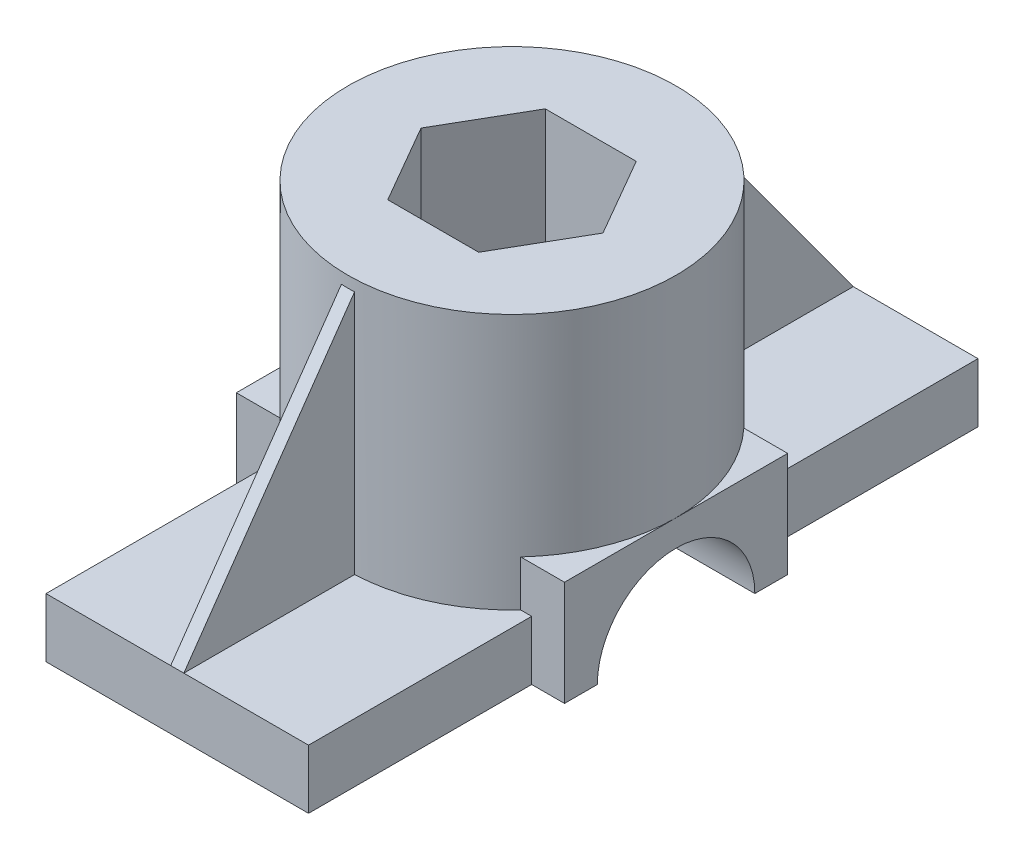
ISO-10303-21;
HEADER;
FILE_DESCRIPTION(('STEP AP214'),'2;1');
FILE_NAME('part.step','',(''),(''),'','','');
FILE_SCHEMA(('AUTOMOTIVE_DESIGN { 1 0 10303 214 1 1 1 1 }'));
ENDSEC;
DATA;
#1=APPLICATION_CONTEXT('core data for automotive mechanical design processes');
#2=APPLICATION_PROTOCOL_DEFINITION('international standard','automotive_design',2000,#1);
#3=PRODUCT_CONTEXT('',#1,'mechanical');
#4=PRODUCT('Part','Part','',(#3));
#5=PRODUCT_RELATED_PRODUCT_CATEGORY('part','',(#4));
#6=PRODUCT_DEFINITION_FORMATION('','',#4);
#7=PRODUCT_DEFINITION_CONTEXT('part definition',#1,'design');
#8=PRODUCT_DEFINITION('design','',#6,#7);
#9=PRODUCT_DEFINITION_SHAPE('','',#8);
#10=(LENGTH_UNIT() NAMED_UNIT(*) SI_UNIT(.MILLI.,.METRE.));
#11=(NAMED_UNIT(*) PLANE_ANGLE_UNIT() SI_UNIT($,.RADIAN.));
#12=(NAMED_UNIT(*) SI_UNIT($,.STERADIAN.) SOLID_ANGLE_UNIT());
#13=UNCERTAINTY_MEASURE_WITH_UNIT(LENGTH_MEASURE(1.E-05),#10,'distance_accuracy_value','');
#14=(GEOMETRIC_REPRESENTATION_CONTEXT(3) GLOBAL_UNCERTAINTY_ASSIGNED_CONTEXT((#13)) GLOBAL_UNIT_ASSIGNED_CONTEXT((#10,
#11,#12)) REPRESENTATION_CONTEXT('',''));
#15=CARTESIAN_POINT('',(0.,0.,0.));
#16=DIRECTION('',(0.,0.,1.));
#17=DIRECTION('',(1.,0.,0.));
#18=AXIS2_PLACEMENT_3D('',#15,#16,#17);
#19=CARTESIAN_POINT('',(0.,9.,-30.4766839378238));
#20=DIRECTION('',(0.,1.,0.));
#21=DIRECTION('',(0.,0.,1.));
#22=AXIS2_PLACEMENT_3D('',#19,#20,#21);
#23=CYLINDRICAL_SURFACE('',#22,25.);
#24=CARTESIAN_POINT('',(0.,48.,-30.4766839378238));
#25=DIRECTION('',(0.,1.,0.));
#26=DIRECTION('',(0.,0.,1.));
#27=AXIS2_PLACEMENT_3D('',#24,#25,#26);
#28=CIRCLE('',#27,25.);
#29=CARTESIAN_POINT('',(0.,48.,-5.47668393782383));
#30=VERTEX_POINT('',#29);
#31=EDGE_CURVE('E474',#30,#30,#28,.T.);
#32=ORIENTED_EDGE('',*,*,#31,.F.);
#33=EDGE_LOOP('',(#32));
#34=FACE_BOUND('',#33,.T.);
#35=CARTESIAN_POINT('',(0.,9.,-30.4766839378238));
#36=DIRECTION('',(0.,-1.,0.));
#37=DIRECTION('',(0.,0.,-1.));
#38=AXIS2_PLACEMENT_3D('',#35,#36,#37);
#39=CIRCLE('',#38,25.);
#40=CARTESIAN_POINT('',(1.,9.,-55.4566759314174));
#41=VERTEX_POINT('',#40);
#42=CARTESIAN_POINT('',(18.3303027798234,9.,-47.4766839378238));
#43=VERTEX_POINT('',#42);
#44=EDGE_CURVE('E386',#41,#43,#39,.T.);
#45=ORIENTED_EDGE('',*,*,#44,.F.);
#46=DIRECTION('',(0.,1.,0.));
#47=VECTOR('',#46,1.);
#48=CARTESIAN_POINT('',(1.,9.,-55.4566759314174));
#49=LINE('',#48,#47);
#50=CARTESIAN_POINT('',(1.,44.5662570889789,-55.4566759314174));
#51=VERTEX_POINT('',#50);
#52=EDGE_CURVE('E418',#41,#51,#49,.T.);
#53=ORIENTED_EDGE('',*,*,#52,.T.);
#54=CARTESIAN_POINT('',(0.,78.7109359494174,-30.4766839378238));
#55=DIRECTION('',(0.,-0.590449655374798,0.807074472689963));
#56=DIRECTION('',(0.,0.807074472689963,0.590449655374798));
#57=AXIS2_PLACEMENT_3D('',#54,#55,#56);
#58=ELLIPSE('',#57,42.3406124001052,25.);
#59=CARTESIAN_POINT('',(-1.,44.5662570889789,-55.4566759314174));
#60=VERTEX_POINT('',#59);
#61=EDGE_CURVE('E250',#51,#60,#58,.F.);
#62=ORIENTED_EDGE('',*,*,#61,.T.);
#63=DIRECTION('',(0.,1.,0.));
#64=VECTOR('',#63,1.);
#65=CARTESIAN_POINT('',(-1.,9.,-55.4566759314174));
#66=LINE('',#65,#64);
#67=CARTESIAN_POINT('',(-1.,9.,-55.4566759314174));
#68=VERTEX_POINT('',#67);
#69=EDGE_CURVE('E258',#68,#60,#66,.T.);
#70=ORIENTED_EDGE('',*,*,#69,.F.);
#71=CARTESIAN_POINT('',(-18.3303027798234,9.,-47.4766839378238));
#72=VERTEX_POINT('',#71);
#73=EDGE_CURVE('E267',#72,#68,#39,.T.);
#74=ORIENTED_EDGE('',*,*,#73,.F.);
#75=DIRECTION('',(0.,1.,0.));
#76=VECTOR('',#75,1.);
#77=CARTESIAN_POINT('',(-18.3303027798234,9.,-47.4766839378238));
#78=LINE('',#77,#76);
#79=CARTESIAN_POINT('',(-18.3303027798234,16.,-47.4766839378238));
#80=VERTEX_POINT('',#79);
#81=EDGE_CURVE('E487',#80,#72,#78,.F.);
#82=ORIENTED_EDGE('',*,*,#81,.F.);
#83=CARTESIAN_POINT('',(0.,16.,-30.4766839378238));
#84=DIRECTION('',(0.,1.,0.));
#85=DIRECTION('',(0.,0.,1.));
#86=AXIS2_PLACEMENT_3D('',#83,#84,#85);
#87=CIRCLE('',#86,25.);
#88=CARTESIAN_POINT('',(-25.,16.,-30.4766839378238));
#89=VERTEX_POINT('',#88);
#90=EDGE_CURVE('E507',#80,#89,#87,.T.);
#91=ORIENTED_EDGE('',*,*,#90,.T.);
#92=CARTESIAN_POINT('',(-18.3303027798234,16.,-13.4766839378238));
#93=VERTEX_POINT('',#92);
#94=EDGE_CURVE('E395',#89,#93,#87,.T.);
#95=ORIENTED_EDGE('',*,*,#94,.T.);
#96=DIRECTION('',(0.,1.,0.));
#97=VECTOR('',#96,1.);
#98=CARTESIAN_POINT('',(-18.3303027798234,9.,-13.4766839378238));
#99=LINE('',#98,#97);
#100=CARTESIAN_POINT('',(-18.3303027798234,9.,-13.4766839378238));
#101=VERTEX_POINT('',#100);
#102=EDGE_CURVE('E485',#101,#93,#99,.T.);
#103=ORIENTED_EDGE('',*,*,#102,.F.);
#104=CARTESIAN_POINT('',(0.,9.,-30.4766839378238));
#105=DIRECTION('',(0.,1.,0.));
#106=DIRECTION('',(0.,0.,1.));
#107=AXIS2_PLACEMENT_3D('',#104,#105,#106);
#108=CIRCLE('',#107,25.);
#109=CARTESIAN_POINT('',(-1.,9.,-5.49669194423024));
#110=VERTEX_POINT('',#109);
#111=EDGE_CURVE('E480',#101,#110,#108,.T.);
#112=ORIENTED_EDGE('',*,*,#111,.T.);
#113=DIRECTION('',(0.,1.,0.));
#114=VECTOR('',#113,1.);
#115=CARTESIAN_POINT('',(-1.,9.,-5.49669194423024));
#116=LINE('',#115,#114);
#117=CARTESIAN_POINT('',(-1.,46.3201014905884,-5.49669194423024));
#118=VERTEX_POINT('',#117);
#119=EDGE_CURVE('E396',#118,#110,#116,.F.);
#120=ORIENTED_EDGE('',*,*,#119,.F.);
#121=CARTESIAN_POINT('',(0.,82.1485238417831,-30.4766839378238));
#122=DIRECTION('',(0.,-0.571926215870423,-0.820305067398793));
#123=DIRECTION('',(0.,0.820305067398793,-0.571926215870423));
#124=AXIS2_PLACEMENT_3D('',#121,#122,#123);
#125=ELLIPSE('',#124,43.7119322497783,25.);
#126=CARTESIAN_POINT('',(1.,46.3201014905884,-5.49669194423024));
#127=VERTEX_POINT('',#126);
#128=EDGE_CURVE('E49',#118,#127,#125,.F.);
#129=ORIENTED_EDGE('',*,*,#128,.T.);
#130=DIRECTION('',(0.,1.,0.));
#131=VECTOR('',#130,1.);
#132=CARTESIAN_POINT('',(1.,9.,-5.49669194423024));
#133=LINE('',#132,#131);
#134=CARTESIAN_POINT('',(1.,9.,-5.49669194423024));
#135=VERTEX_POINT('',#134);
#136=EDGE_CURVE('E11',#127,#135,#133,.F.);
#137=ORIENTED_EDGE('',*,*,#136,.T.);
#138=CARTESIAN_POINT('',(18.3303027798234,9.,-13.4766839378238));
#139=VERTEX_POINT('',#138);
#140=EDGE_CURVE('E477',#135,#139,#108,.T.);
#141=ORIENTED_EDGE('',*,*,#140,.T.);
#142=DIRECTION('',(0.,1.,0.));
#143=VECTOR('',#142,1.);
#144=CARTESIAN_POINT('',(18.3303027798234,9.,-13.4766839378238));
#145=LINE('',#144,#143);
#146=CARTESIAN_POINT('',(18.3303027798234,16.,-13.4766839378238));
#147=VERTEX_POINT('',#146);
#148=EDGE_CURVE('E482',#147,#139,#145,.F.);
#149=ORIENTED_EDGE('',*,*,#148,.F.);
#150=CARTESIAN_POINT('',(25.,16.,-30.4766839378238));
#151=VERTEX_POINT('',#150);
#152=EDGE_CURVE('E473',#147,#151,#87,.T.);
#153=ORIENTED_EDGE('',*,*,#152,.T.);
#154=CARTESIAN_POINT('',(18.3303027798234,16.,-47.4766839378238));
#155=VERTEX_POINT('',#154);
#156=EDGE_CURVE('E398',#151,#155,#87,.T.);
#157=ORIENTED_EDGE('',*,*,#156,.T.);
#158=DIRECTION('',(0.,1.,0.));
#159=VECTOR('',#158,1.);
#160=CARTESIAN_POINT('',(18.3303027798234,9.,-47.4766839378238));
#161=LINE('',#160,#159);
#162=EDGE_CURVE('E285',#43,#155,#161,.T.);
#163=ORIENTED_EDGE('',*,*,#162,.F.);
#164=EDGE_LOOP('',(#45,#53,#62,#70,#74,#82,#91,#95,#103,#112,#120,#129,#137,#141,#149,#153,#157,#163));
#165=FACE_BOUND('',#164,.T.);
#166=ADVANCED_FACE('F41',(#34,#165),#23,.T.);
#167=CARTESIAN_POINT('',(20.,9.,-81.4766839378238));
#168=DIRECTION('',(0.,-1.,0.));
#169=DIRECTION('',(0.,0.,-1.));
#170=AXIS2_PLACEMENT_3D('',#167,#168,#169);
#171=PLANE('',#170);
#172=DIRECTION('',(0.,0.,-1.));
#173=VECTOR('',#172,1.);
#174=CARTESIAN_POINT('',(1.,9.,-54.2188227791459));
#175=LINE('',#174,#173);
#176=CARTESIAN_POINT('',(0.999999999999997,9.,-81.4766839378238));
#177=VERTEX_POINT('',#176);
#178=EDGE_CURVE('E251',#41,#177,#175,.T.);
#179=ORIENTED_EDGE('',*,*,#178,.F.);
#180=ORIENTED_EDGE('',*,*,#44,.T.);
#181=DIRECTION('',(1.,0.,0.));
#182=VECTOR('',#181,1.);
#183=CARTESIAN_POINT('',(20.,9.,-47.4766839378238));
#184=LINE('',#183,#182);
#185=CARTESIAN_POINT('',(20.,9.,-47.4766839378238));
#186=VERTEX_POINT('',#185);
#187=EDGE_CURVE('E284',#43,#186,#184,.T.);
#188=ORIENTED_EDGE('',*,*,#187,.T.);
#189=DIRECTION('',(0.,0.,1.));
#190=VECTOR('',#189,1.);
#191=CARTESIAN_POINT('',(20.,9.,-81.4766839378238));
#192=LINE('',#191,#190);
#193=CARTESIAN_POINT('',(20.,9.,-81.4766839378238));
#194=VERTEX_POINT('',#193);
#195=EDGE_CURVE('E294',#194,#186,#192,.T.);
#196=ORIENTED_EDGE('',*,*,#195,.F.);
#197=DIRECTION('',(1.,0.,0.));
#198=VECTOR('',#197,1.);
#199=CARTESIAN_POINT('',(20.,9.,-81.4766839378238));
#200=LINE('',#199,#198);
#201=EDGE_CURVE('E274',#177,#194,#200,.T.);
#202=ORIENTED_EDGE('',*,*,#201,.F.);
#203=EDGE_LOOP('',(#179,#180,#188,#196,#202));
#204=FACE_BOUND('',#203,.T.);
#205=ADVANCED_FACE('F520',(#204),#171,.F.);
#206=CARTESIAN_POINT('',(-20.,9.,20.5233160621762));
#207=DIRECTION('',(0.,1.,0.));
#208=DIRECTION('',(0.,0.,1.));
#209=AXIS2_PLACEMENT_3D('',#206,#207,#208);
#210=PLANE('',#209);
#211=ORIENTED_EDGE('',*,*,#140,.F.);
#212=DIRECTION('',(0.,0.,1.));
#213=VECTOR('',#212,1.);
#214=CARTESIAN_POINT('',(1.,9.,20.5233160621762));
#215=LINE('',#214,#213);
#216=CARTESIAN_POINT('',(1.,9.,20.5233160621762));
#217=VERTEX_POINT('',#216);
#218=EDGE_CURVE('E64',#135,#217,#215,.T.);
#219=ORIENTED_EDGE('',*,*,#218,.T.);
#220=DIRECTION('',(1.,0.,0.));
#221=VECTOR('',#220,1.);
#222=CARTESIAN_POINT('',(-20.,9.,20.5233160621762));
#223=LINE('',#222,#221);
#224=CARTESIAN_POINT('',(20.,9.,20.5233160621762));
#225=VERTEX_POINT('',#224);
#226=EDGE_CURVE('E390',#217,#225,#223,.T.);
#227=ORIENTED_EDGE('',*,*,#226,.T.);
#228=DIRECTION('',(0.,0.,1.));
#229=VECTOR('',#228,1.);
#230=CARTESIAN_POINT('',(20.,9.,20.5233160621762));
#231=LINE('',#230,#229);
#232=CARTESIAN_POINT('',(20.,9.,-13.4766839378238));
#233=VERTEX_POINT('',#232);
#234=EDGE_CURVE('E379',#233,#225,#231,.T.);
#235=ORIENTED_EDGE('',*,*,#234,.F.);
#236=DIRECTION('',(1.,0.,0.));
#237=VECTOR('',#236,1.);
#238=CARTESIAN_POINT('',(-20.,9.,-13.4766839378238));
#239=LINE('',#238,#237);
#240=EDGE_CURVE('E376',#139,#233,#239,.T.);
#241=ORIENTED_EDGE('',*,*,#240,.F.);
#242=EDGE_LOOP('',(#211,#219,#227,#235,#241));
#243=FACE_BOUND('',#242,.T.);
#244=ADVANCED_FACE('F585',(#243),#210,.T.);
#245=CARTESIAN_POINT('',(-25.,0.,-30.4766839378238));
#246=DIRECTION('',(1.,0.,0.));
#247=DIRECTION('',(0.,0.,-1.));
#248=AXIS2_PLACEMENT_3D('',#245,#246,#247);
#249=CYLINDRICAL_SURFACE('',#248,12.);
#250=CARTESIAN_POINT('',(-13.856406460551,0.,-30.4766839378238));
#251=DIRECTION('',(-0.866025403784439,0.,-0.5));
#252=DIRECTION('',(0.5,0.,-0.866025403784439));
#253=AXIS2_PLACEMENT_3D('',#250,#251,#252);
#254=ELLIPSE('',#253,13.856406460551,12.);
#255=CARTESIAN_POINT('',(-13.856406460551,12.,-30.4766839378238));
#256=VERTEX_POINT('',#255);
#257=CARTESIAN_POINT('',(-6.92820323027552,0.,-42.4766839378238));
#258=VERTEX_POINT('',#257);
#259=EDGE_CURVE('E434',#256,#258,#254,.T.);
#260=ORIENTED_EDGE('',*,*,#259,.F.);
#261=CARTESIAN_POINT('',(-13.856406460551,0.,-30.4766839378238));
#262=DIRECTION('',(-0.866025403784439,0.,0.5));
#263=DIRECTION('',(0.5,0.,0.866025403784439));
#264=AXIS2_PLACEMENT_3D('',#261,#262,#263);
#265=ELLIPSE('',#264,13.856406460551,12.);
#266=CARTESIAN_POINT('',(-6.92820323027552,0.,-18.4766839378238));
#267=VERTEX_POINT('',#266);
#268=EDGE_CURVE('E437',#267,#256,#265,.T.);
#269=ORIENTED_EDGE('',*,*,#268,.F.);
#270=DIRECTION('',(1.,0.,0.));
#271=VECTOR('',#270,1.);
#272=CARTESIAN_POINT('',(-25.,0.,-18.4766839378238));
#273=LINE('',#272,#271);
#274=CARTESIAN_POINT('',(-25.,0.,-18.4766839378238));
#275=VERTEX_POINT('',#274);
#276=EDGE_CURVE('E355',#275,#267,#273,.T.);
#277=ORIENTED_EDGE('',*,*,#276,.F.);
#278=CARTESIAN_POINT('',(-25.,0.,-30.4766839378238));
#279=DIRECTION('',(-1.,0.,0.));
#280=DIRECTION('',(0.,0.,1.));
#281=AXIS2_PLACEMENT_3D('',#278,#279,#280);
#282=CIRCLE('',#281,12.);
#283=CARTESIAN_POINT('',(-25.,0.,-42.4766839378238));
#284=VERTEX_POINT('',#283);
#285=EDGE_CURVE('E327',#284,#275,#282,.F.);
#286=ORIENTED_EDGE('',*,*,#285,.F.);
#287=DIRECTION('',(1.,0.,0.));
#288=VECTOR('',#287,1.);
#289=CARTESIAN_POINT('',(-25.,0.,-42.4766839378238));
#290=LINE('',#289,#288);
#291=EDGE_CURVE('E359',#284,#258,#290,.T.);
#292=ORIENTED_EDGE('',*,*,#291,.T.);
#293=EDGE_LOOP('',(#260,#269,#277,#286,#292));
#294=FACE_BOUND('',#293,.T.);
#295=ADVANCED_FACE('F609',(#294),#249,.F.);
#296=CARTESIAN_POINT('',(-25.,16.,0.));
#297=DIRECTION('',(0.,-1.,0.));
#298=DIRECTION('',(0.,0.,-1.));
#299=AXIS2_PLACEMENT_3D('',#296,#297,#298);
#300=PLANE('',#299);
#301=ORIENTED_EDGE('',*,*,#152,.F.);
#302=DIRECTION('',(1.,0.,0.));
#303=VECTOR('',#302,1.);
#304=CARTESIAN_POINT('',(-25.,16.,-13.4766839378238));
#305=LINE('',#304,#303);
#306=CARTESIAN_POINT('',(25.,16.,-13.4766839378238));
#307=VERTEX_POINT('',#306);
#308=EDGE_CURVE('E347',#147,#307,#305,.T.);
#309=ORIENTED_EDGE('',*,*,#308,.T.);
#310=DIRECTION('',(0.,0.,-1.));
#311=VECTOR('',#310,1.);
#312=CARTESIAN_POINT('',(25.,16.,0.));
#313=LINE('',#312,#311);
#314=EDGE_CURVE('E314',#307,#151,#313,.T.);
#315=ORIENTED_EDGE('',*,*,#314,.T.);
#316=EDGE_LOOP('',(#301,#309,#315));
#317=FACE_BOUND('',#316,.T.);
#318=ADVANCED_FACE('F606',(#317),#300,.F.);
#319=ORIENTED_EDGE('',*,*,#156,.F.);
#320=CARTESIAN_POINT('',(25.,16.,-47.4766839378238));
#321=VERTEX_POINT('',#320);
#322=EDGE_CURVE('E313',#151,#321,#313,.T.);
#323=ORIENTED_EDGE('',*,*,#322,.T.);
#324=DIRECTION('',(1.,0.,0.));
#325=VECTOR('',#324,1.);
#326=CARTESIAN_POINT('',(-25.,16.,-47.4766839378238));
#327=LINE('',#326,#325);
#328=EDGE_CURVE('E343',#155,#321,#327,.T.);
#329=ORIENTED_EDGE('',*,*,#328,.F.);
#330=EDGE_LOOP('',(#319,#323,#329));
#331=FACE_BOUND('',#330,.T.);
#332=ADVANCED_FACE('F538',(#331),#300,.F.);
#333=ORIENTED_EDGE('',*,*,#90,.F.);
#334=CARTESIAN_POINT('',(-25.,16.,-47.4766839378238));
#335=VERTEX_POINT('',#334);
#336=EDGE_CURVE('E344',#335,#80,#327,.T.);
#337=ORIENTED_EDGE('',*,*,#336,.F.);
#338=DIRECTION('',(0.,0.,-1.));
#339=VECTOR('',#338,1.);
#340=CARTESIAN_POINT('',(-25.,16.,0.));
#341=LINE('',#340,#339);
#342=EDGE_CURVE('E333',#89,#335,#341,.T.);
#343=ORIENTED_EDGE('',*,*,#342,.F.);
#344=EDGE_LOOP('',(#333,#337,#343));
#345=FACE_BOUND('',#344,.T.);
#346=ADVANCED_FACE('F548',(#345),#300,.F.);
#347=ORIENTED_EDGE('',*,*,#94,.F.);
#348=CARTESIAN_POINT('',(-25.,16.,-13.4766839378238));
#349=VERTEX_POINT('',#348);
#350=EDGE_CURVE('E334',#349,#89,#341,.T.);
#351=ORIENTED_EDGE('',*,*,#350,.F.);
#352=EDGE_CURVE('E348',#349,#93,#305,.T.);
#353=ORIENTED_EDGE('',*,*,#352,.T.);
#354=EDGE_LOOP('',(#347,#351,#353));
#355=FACE_BOUND('',#354,.T.);
#356=ADVANCED_FACE('F545',(#355),#300,.F.);
#357=CARTESIAN_POINT('',(-25.,0.,-47.4766839378238));
#358=DIRECTION('',(0.,0.,1.));
#359=DIRECTION('',(1.,0.,0.));
#360=AXIS2_PLACEMENT_3D('',#357,#358,#359);
#361=PLANE('',#360);
#362=ORIENTED_EDGE('',*,*,#187,.F.);
#363=ORIENTED_EDGE('',*,*,#162,.T.);
#364=ORIENTED_EDGE('',*,*,#328,.T.);
#365=DIRECTION('',(0.,-1.,0.));
#366=VECTOR('',#365,1.);
#367=CARTESIAN_POINT('',(25.,0.,-47.4766839378238));
#368=LINE('',#367,#366);
#369=CARTESIAN_POINT('',(25.,0.,-47.4766839378238));
#370=VERTEX_POINT('',#369);
#371=EDGE_CURVE('E309',#321,#370,#368,.T.);
#372=ORIENTED_EDGE('',*,*,#371,.T.);
#373=DIRECTION('',(1.,0.,0.));
#374=VECTOR('',#373,1.);
#375=CARTESIAN_POINT('',(-25.,0.,-47.4766839378238));
#376=LINE('',#375,#374);
#377=CARTESIAN_POINT('',(20.,0.,-47.4766839378238));
#378=VERTEX_POINT('',#377);
#379=EDGE_CURVE('E339',#378,#370,#376,.T.);
#380=ORIENTED_EDGE('',*,*,#379,.F.);
#381=DIRECTION('',(0.,-1.,0.));
#382=VECTOR('',#381,1.);
#383=CARTESIAN_POINT('',(20.,0.,-47.4766839378238));
#384=LINE('',#383,#382);
#385=EDGE_CURVE('E288',#186,#378,#384,.T.);
#386=ORIENTED_EDGE('',*,*,#385,.F.);
#387=EDGE_LOOP('',(#362,#363,#364,#372,#380,#386));
#388=FACE_BOUND('',#387,.T.);
#389=ADVANCED_FACE('F535',(#388),#361,.F.);
#390=CARTESIAN_POINT('',(-25.,0.,-13.4766839378238));
#391=DIRECTION('',(0.,0.,-1.));
#392=DIRECTION('',(-1.,0.,0.));
#393=AXIS2_PLACEMENT_3D('',#390,#391,#392);
#394=PLANE('',#393);
#395=CARTESIAN_POINT('',(-20.,9.,-13.4766839378238));
#396=VERTEX_POINT('',#395);
#397=EDGE_CURVE('E391',#396,#101,#239,.T.);
#398=ORIENTED_EDGE('',*,*,#397,.T.);
#399=ORIENTED_EDGE('',*,*,#102,.T.);
#400=ORIENTED_EDGE('',*,*,#352,.F.);
#401=DIRECTION('',(0.,1.,0.));
#402=VECTOR('',#401,1.);
#403=CARTESIAN_POINT('',(-25.,0.,-13.4766839378238));
#404=LINE('',#403,#402);
#405=CARTESIAN_POINT('',(-25.,0.,-13.4766839378238));
#406=VERTEX_POINT('',#405);
#407=EDGE_CURVE('E331',#406,#349,#404,.T.);
#408=ORIENTED_EDGE('',*,*,#407,.F.);
#409=DIRECTION('',(1.,0.,0.));
#410=VECTOR('',#409,1.);
#411=CARTESIAN_POINT('',(-25.,0.,-13.4766839378238));
#412=LINE('',#411,#410);
#413=CARTESIAN_POINT('',(-20.,0.,-13.4766839378238));
#414=VERTEX_POINT('',#413);
#415=EDGE_CURVE('E351',#406,#414,#412,.T.);
#416=ORIENTED_EDGE('',*,*,#415,.T.);
#417=DIRECTION('',(0.,1.,0.));
#418=VECTOR('',#417,1.);
#419=CARTESIAN_POINT('',(-20.,9.,-13.4766839378238));
#420=LINE('',#419,#418);
#421=EDGE_CURVE('E366',#414,#396,#420,.T.);
#422=ORIENTED_EDGE('',*,*,#421,.T.);
#423=EDGE_LOOP('',(#398,#399,#400,#408,#416,#422));
#424=FACE_BOUND('',#423,.T.);
#425=ADVANCED_FACE('F555',(#424),#394,.F.);
#426=ORIENTED_EDGE('',*,*,#336,.T.);
#427=ORIENTED_EDGE('',*,*,#81,.T.);
#428=CARTESIAN_POINT('',(-20.,9.,-47.4766839378238));
#429=VERTEX_POINT('',#428);
#430=EDGE_CURVE('E286',#429,#72,#184,.T.);
#431=ORIENTED_EDGE('',*,*,#430,.F.);
#432=DIRECTION('',(0.,1.,0.));
#433=VECTOR('',#432,1.);
#434=CARTESIAN_POINT('',(-20.,9.,-47.4766839378238));
#435=LINE('',#434,#433);
#436=CARTESIAN_POINT('',(-20.,0.,-47.4766839378238));
#437=VERTEX_POINT('',#436);
#438=EDGE_CURVE('E281',#437,#429,#435,.T.);
#439=ORIENTED_EDGE('',*,*,#438,.F.);
#440=CARTESIAN_POINT('',(-25.,0.,-47.4766839378238));
#441=VERTEX_POINT('',#440);
#442=EDGE_CURVE('E340',#441,#437,#376,.T.);
#443=ORIENTED_EDGE('',*,*,#442,.F.);
#444=DIRECTION('',(0.,-1.,0.));
#445=VECTOR('',#444,1.);
#446=CARTESIAN_POINT('',(-25.,0.,-47.4766839378238));
#447=LINE('',#446,#445);
#448=EDGE_CURVE('E337',#335,#441,#447,.T.);
#449=ORIENTED_EDGE('',*,*,#448,.F.);
#450=EDGE_LOOP('',(#426,#427,#431,#439,#443,#449));
#451=FACE_BOUND('',#450,.T.);
#452=ADVANCED_FACE('F501',(#451),#361,.F.);
#453=CARTESIAN_POINT('',(-20.,0.,-13.4766839378238));
#454=DIRECTION('',(0.,-1.,0.));
#455=DIRECTION('',(0.,0.,-1.));
#456=AXIS2_PLACEMENT_3D('',#453,#454,#455);
#457=PLANE('',#456);
#458=DIRECTION('',(0.,0.,-1.));
#459=VECTOR('',#458,1.);
#460=CARTESIAN_POINT('',(20.,0.,-13.4766839378238));
#461=LINE('',#460,#459);
#462=CARTESIAN_POINT('',(20.,0.,20.5233160621762));
#463=VERTEX_POINT('',#462);
#464=CARTESIAN_POINT('',(20.,0.,-13.4766839378238));
#465=VERTEX_POINT('',#464);
#466=EDGE_CURVE('E362',#463,#465,#461,.T.);
#467=ORIENTED_EDGE('',*,*,#466,.F.);
#468=DIRECTION('',(1.,0.,0.));
#469=VECTOR('',#468,1.);
#470=CARTESIAN_POINT('',(-20.,0.,20.5233160621762));
#471=LINE('',#470,#469);
#472=CARTESIAN_POINT('',(-20.,0.,20.5233160621762));
#473=VERTEX_POINT('',#472);
#474=EDGE_CURVE('E384',#473,#463,#471,.T.);
#475=ORIENTED_EDGE('',*,*,#474,.F.);
#476=DIRECTION('',(0.,0.,-1.));
#477=VECTOR('',#476,1.);
#478=CARTESIAN_POINT('',(-20.,0.,-13.4766839378238));
#479=LINE('',#478,#477);
#480=EDGE_CURVE('E363',#473,#414,#479,.T.);
#481=ORIENTED_EDGE('',*,*,#480,.T.);
#482=ORIENTED_EDGE('',*,*,#415,.F.);
#483=DIRECTION('',(0.,0.,1.));
#484=VECTOR('',#483,1.);
#485=CARTESIAN_POINT('',(-25.,0.,0.));
#486=LINE('',#485,#484);
#487=EDGE_CURVE('E329',#275,#406,#486,.T.);
#488=ORIENTED_EDGE('',*,*,#487,.F.);
#489=ORIENTED_EDGE('',*,*,#276,.T.);
#490=DIRECTION('',(1.,0.,0.));
#491=VECTOR('',#490,1.);
#492=CARTESIAN_POINT('',(-25.,0.,-18.4766839378238));
#493=LINE('',#492,#491);
#494=CARTESIAN_POINT('',(6.92820323027547,0.,-18.4766839378238));
#495=VERTEX_POINT('',#494);
#496=EDGE_CURVE('E426',#267,#495,#493,.T.);
#497=ORIENTED_EDGE('',*,*,#496,.T.);
#498=CARTESIAN_POINT('',(25.,0.,-18.4766839378238));
#499=VERTEX_POINT('',#498);
#500=EDGE_CURVE('E354',#495,#499,#273,.T.);
#501=ORIENTED_EDGE('',*,*,#500,.T.);
#502=DIRECTION('',(0.,0.,1.));
#503=VECTOR('',#502,1.);
#504=CARTESIAN_POINT('',(25.,0.,0.));
#505=LINE('',#504,#503);
#506=CARTESIAN_POINT('',(25.,0.,-13.4766839378238));
#507=VERTEX_POINT('',#506);
#508=EDGE_CURVE('E310',#499,#507,#505,.T.);
#509=ORIENTED_EDGE('',*,*,#508,.T.);
#510=DIRECTION('',(-1.,0.,0.));
#511=VECTOR('',#510,1.);
#512=CARTESIAN_POINT('',(25.,0.,-13.4766839378238));
#513=LINE('',#512,#511);
#514=EDGE_CURVE('E322',#507,#465,#513,.T.);
#515=ORIENTED_EDGE('',*,*,#514,.T.);
#516=EDGE_LOOP('',(#467,#475,#481,#482,#488,#489,#497,#501,#509,#515));
#517=FACE_BOUND('',#516,.T.);
#518=ADVANCED_FACE('F43',(#517),#457,.T.);
#519=CARTESIAN_POINT('',(-20.,0.,20.5233160621762));
#520=DIRECTION('',(0.,0.,1.));
#521=DIRECTION('',(1.,0.,0.));
#522=AXIS2_PLACEMENT_3D('',#519,#520,#521);
#523=PLANE('',#522);
#524=DIRECTION('',(0.,-1.,0.));
#525=VECTOR('',#524,1.);
#526=CARTESIAN_POINT('',(20.,0.,20.5233160621762));
#527=LINE('',#526,#525);
#528=EDGE_CURVE('E367',#225,#463,#527,.T.);
#529=ORIENTED_EDGE('',*,*,#528,.F.);
#530=ORIENTED_EDGE('',*,*,#226,.F.);
#531=DIRECTION('',(-1.,0.,0.));
#532=VECTOR('',#531,1.);
#533=CARTESIAN_POINT('',(1.,9.,20.5233160621762));
#534=LINE('',#533,#532);
#535=CARTESIAN_POINT('',(-1.,9.,20.5233160621762));
#536=VERTEX_POINT('',#535);
#537=EDGE_CURVE('E413',#217,#536,#534,.T.);
#538=ORIENTED_EDGE('',*,*,#537,.T.);
#539=CARTESIAN_POINT('',(-20.,9.,20.5233160621762));
#540=VERTEX_POINT('',#539);
#541=EDGE_CURVE('E387',#540,#536,#223,.T.);
#542=ORIENTED_EDGE('',*,*,#541,.F.);
#543=DIRECTION('',(0.,-1.,0.));
#544=VECTOR('',#543,1.);
#545=CARTESIAN_POINT('',(-20.,0.,20.5233160621762));
#546=LINE('',#545,#544);
#547=EDGE_CURVE('E373',#540,#473,#546,.T.);
#548=ORIENTED_EDGE('',*,*,#547,.T.);
#549=ORIENTED_EDGE('',*,*,#474,.T.);
#550=EDGE_LOOP('',(#529,#530,#538,#542,#548,#549));
#551=FACE_BOUND('',#550,.T.);
#552=ADVANCED_FACE('F566',(#551),#523,.T.);
#553=DIRECTION('',(0.,0.,1.));
#554=VECTOR('',#553,1.);
#555=CARTESIAN_POINT('',(-1.,9.,20.5233160621762));
#556=LINE('',#555,#554);
#557=EDGE_CURVE('E416',#110,#536,#556,.T.);
#558=ORIENTED_EDGE('',*,*,#557,.F.);
#559=ORIENTED_EDGE('',*,*,#111,.F.);
#560=ORIENTED_EDGE('',*,*,#397,.F.);
#561=DIRECTION('',(0.,0.,1.));
#562=VECTOR('',#561,1.);
#563=CARTESIAN_POINT('',(-20.,9.,20.5233160621762));
#564=LINE('',#563,#562);
#565=EDGE_CURVE('E370',#396,#540,#564,.T.);
#566=ORIENTED_EDGE('',*,*,#565,.T.);
#567=ORIENTED_EDGE('',*,*,#541,.T.);
#568=EDGE_LOOP('',(#558,#559,#560,#566,#567));
#569=FACE_BOUND('',#568,.T.);
#570=ADVANCED_FACE('F559',(#569),#210,.T.);
#571=CARTESIAN_POINT('',(-20.,0.,0.));
#572=DIRECTION('',(-1.,0.,0.));
#573=DIRECTION('',(0.,0.,1.));
#574=AXIS2_PLACEMENT_3D('',#571,#572,#573);
#575=PLANE('',#574);
#576=ORIENTED_EDGE('',*,*,#480,.F.);
#577=ORIENTED_EDGE('',*,*,#547,.F.);
#578=ORIENTED_EDGE('',*,*,#565,.F.);
#579=ORIENTED_EDGE('',*,*,#421,.F.);
#580=EDGE_LOOP('',(#576,#577,#578,#579));
#581=FACE_BOUND('',#580,.T.);
#582=ADVANCED_FACE('F563',(#581),#575,.T.);
#583=CARTESIAN_POINT('',(20.,0.,0.));
#584=DIRECTION('',(-1.,0.,0.));
#585=DIRECTION('',(0.,0.,1.));
#586=AXIS2_PLACEMENT_3D('',#583,#584,#585);
#587=PLANE('',#586);
#588=ORIENTED_EDGE('',*,*,#466,.T.);
#589=DIRECTION('',(0.,1.,0.));
#590=VECTOR('',#589,1.);
#591=CARTESIAN_POINT('',(20.,0.,-13.4766839378238));
#592=LINE('',#591,#590);
#593=EDGE_CURVE('E302',#465,#233,#592,.T.);
#594=ORIENTED_EDGE('',*,*,#593,.T.);
#595=ORIENTED_EDGE('',*,*,#234,.T.);
#596=ORIENTED_EDGE('',*,*,#528,.T.);
#597=EDGE_LOOP('',(#588,#594,#595,#596));
#598=FACE_BOUND('',#597,.T.);
#599=ADVANCED_FACE('F614',(#598),#587,.F.);
#600=ORIENTED_EDGE('',*,*,#308,.F.);
#601=ORIENTED_EDGE('',*,*,#148,.T.);
#602=ORIENTED_EDGE('',*,*,#240,.T.);
#603=ORIENTED_EDGE('',*,*,#593,.F.);
#604=ORIENTED_EDGE('',*,*,#514,.F.);
#605=DIRECTION('',(0.,1.,0.));
#606=VECTOR('',#605,1.);
#607=CARTESIAN_POINT('',(25.,0.,-13.4766839378238));
#608=LINE('',#607,#606);
#609=EDGE_CURVE('E317',#507,#307,#608,.T.);
#610=ORIENTED_EDGE('',*,*,#609,.T.);
#611=EDGE_LOOP('',(#600,#601,#602,#603,#604,#610));
#612=FACE_BOUND('',#611,.T.);
#613=ADVANCED_FACE('F611',(#612),#394,.F.);
#614=CARTESIAN_POINT('',(-25.,0.,0.));
#615=DIRECTION('',(0.,1.,0.));
#616=DIRECTION('',(0.,0.,1.));
#617=AXIS2_PLACEMENT_3D('',#614,#615,#616);
#618=PLANE('',#617);
#619=ORIENTED_EDGE('',*,*,#442,.T.);
#620=DIRECTION('',(0.,0.,1.));
#621=VECTOR('',#620,1.);
#622=CARTESIAN_POINT('',(-20.,0.,-81.4766839378238));
#623=LINE('',#622,#621);
#624=CARTESIAN_POINT('',(-20.,0.,-81.4766839378238));
#625=VERTEX_POINT('',#624);
#626=EDGE_CURVE('E299',#625,#437,#623,.T.);
#627=ORIENTED_EDGE('',*,*,#626,.F.);
#628=DIRECTION('',(-1.,0.,0.));
#629=VECTOR('',#628,1.);
#630=CARTESIAN_POINT('',(-20.,0.,-81.4766839378238));
#631=LINE('',#630,#629);
#632=CARTESIAN_POINT('',(20.,0.,-81.4766839378238));
#633=VERTEX_POINT('',#632);
#634=EDGE_CURVE('E291',#633,#625,#631,.T.);
#635=ORIENTED_EDGE('',*,*,#634,.F.);
#636=DIRECTION('',(0.,0.,1.));
#637=VECTOR('',#636,1.);
#638=CARTESIAN_POINT('',(20.,0.,-81.4766839378238));
#639=LINE('',#638,#637);
#640=EDGE_CURVE('E276',#633,#378,#639,.T.);
#641=ORIENTED_EDGE('',*,*,#640,.T.);
#642=ORIENTED_EDGE('',*,*,#379,.T.);
#643=CARTESIAN_POINT('',(25.,0.,-42.4766839378238));
#644=VERTEX_POINT('',#643);
#645=EDGE_CURVE('E306',#370,#644,#505,.T.);
#646=ORIENTED_EDGE('',*,*,#645,.T.);
#647=CARTESIAN_POINT('',(6.92820323027549,0.,-42.4766839378238));
#648=VERTEX_POINT('',#647);
#649=EDGE_CURVE('E358',#648,#644,#290,.T.);
#650=ORIENTED_EDGE('',*,*,#649,.F.);
#651=DIRECTION('',(1.,0.,0.));
#652=VECTOR('',#651,1.);
#653=CARTESIAN_POINT('',(-25.,0.,-42.4766839378238));
#654=LINE('',#653,#652);
#655=EDGE_CURVE('E429',#258,#648,#654,.T.);
#656=ORIENTED_EDGE('',*,*,#655,.F.);
#657=ORIENTED_EDGE('',*,*,#291,.F.);
#658=DIRECTION('',(0.,0.,1.));
#659=VECTOR('',#658,1.);
#660=CARTESIAN_POINT('',(-25.,0.,0.));
#661=LINE('',#660,#659);
#662=EDGE_CURVE('E324',#441,#284,#661,.T.);
#663=ORIENTED_EDGE('',*,*,#662,.F.);
#664=EDGE_LOOP('',(#619,#627,#635,#641,#642,#646,#650,#656,#657,#663));
#665=FACE_BOUND('',#664,.T.);
#666=ADVANCED_FACE('F495',(#665),#618,.F.);
#667=ORIENTED_EDGE('',*,*,#500,.F.);
#668=CARTESIAN_POINT('',(13.856406460551,0.,-30.4766839378238));
#669=DIRECTION('',(0.866025403784439,0.,0.5));
#670=DIRECTION('',(0.5,0.,-0.866025403784439));
#671=AXIS2_PLACEMENT_3D('',#668,#669,#670);
#672=ELLIPSE('',#671,13.856406460551,12.);
#673=CARTESIAN_POINT('',(13.856406460551,12.,-30.4766839378238));
#674=VERTEX_POINT('',#673);
#675=EDGE_CURVE('E432',#674,#495,#672,.T.);
#676=ORIENTED_EDGE('',*,*,#675,.F.);
#677=CARTESIAN_POINT('',(13.856406460551,0.,-30.4766839378238));
#678=DIRECTION('',(0.866025403784439,0.,-0.5));
#679=DIRECTION('',(0.5,0.,0.866025403784439));
#680=AXIS2_PLACEMENT_3D('',#677,#678,#679);
#681=ELLIPSE('',#680,13.856406460551,12.);
#682=EDGE_CURVE('E460',#648,#674,#681,.T.);
#683=ORIENTED_EDGE('',*,*,#682,.F.);
#684=ORIENTED_EDGE('',*,*,#649,.T.);
#685=CARTESIAN_POINT('',(25.,0.,-30.4766839378238));
#686=DIRECTION('',(1.,0.,0.));
#687=DIRECTION('',(0.,0.,-1.));
#688=AXIS2_PLACEMENT_3D('',#685,#686,#687);
#689=CIRCLE('',#688,12.);
#690=EDGE_CURVE('E303',#644,#499,#689,.T.);
#691=ORIENTED_EDGE('',*,*,#690,.T.);
#692=EDGE_LOOP('',(#667,#676,#683,#684,#691));
#693=FACE_BOUND('',#692,.T.);
#694=ADVANCED_FACE('F603',(#693),#249,.F.);
#695=CARTESIAN_POINT('',(-25.,0.,0.));
#696=DIRECTION('',(-1.,0.,0.));
#697=DIRECTION('',(0.,0.,1.));
#698=AXIS2_PLACEMENT_3D('',#695,#696,#697);
#699=PLANE('',#698);
#700=ORIENTED_EDGE('',*,*,#350,.T.);
#701=ORIENTED_EDGE('',*,*,#342,.T.);
#702=ORIENTED_EDGE('',*,*,#448,.T.);
#703=ORIENTED_EDGE('',*,*,#662,.T.);
#704=ORIENTED_EDGE('',*,*,#285,.T.);
#705=ORIENTED_EDGE('',*,*,#487,.T.);
#706=ORIENTED_EDGE('',*,*,#407,.T.);
#707=EDGE_LOOP('',(#700,#701,#702,#703,#704,#705,#706));
#708=FACE_BOUND('',#707,.T.);
#709=ADVANCED_FACE('F550',(#708),#699,.T.);
#710=CARTESIAN_POINT('',(25.,0.,0.));
#711=DIRECTION('',(1.,0.,0.));
#712=DIRECTION('',(0.,0.,-1.));
#713=AXIS2_PLACEMENT_3D('',#710,#711,#712);
#714=PLANE('',#713);
#715=ORIENTED_EDGE('',*,*,#371,.F.);
#716=ORIENTED_EDGE('',*,*,#322,.F.);
#717=ORIENTED_EDGE('',*,*,#314,.F.);
#718=ORIENTED_EDGE('',*,*,#609,.F.);
#719=ORIENTED_EDGE('',*,*,#508,.F.);
#720=ORIENTED_EDGE('',*,*,#690,.F.);
#721=ORIENTED_EDGE('',*,*,#645,.F.);
#722=EDGE_LOOP('',(#715,#716,#717,#718,#719,#720,#721));
#723=FACE_BOUND('',#722,.T.);
#724=ADVANCED_FACE('F531',(#723),#714,.T.);
#725=CARTESIAN_POINT('',(-20.,9.,-81.4766839378238));
#726=DIRECTION('',(1.,0.,0.));
#727=DIRECTION('',(0.,0.,-1.));
#728=AXIS2_PLACEMENT_3D('',#725,#726,#727);
#729=PLANE('',#728);
#730=ORIENTED_EDGE('',*,*,#438,.T.);
#731=DIRECTION('',(0.,0.,1.));
#732=VECTOR('',#731,1.);
#733=CARTESIAN_POINT('',(-20.,9.,-81.4766839378238));
#734=LINE('',#733,#732);
#735=CARTESIAN_POINT('',(-20.,9.,-81.4766839378238));
#736=VERTEX_POINT('',#735);
#737=EDGE_CURVE('E297',#736,#429,#734,.T.);
#738=ORIENTED_EDGE('',*,*,#737,.F.);
#739=DIRECTION('',(0.,1.,0.));
#740=VECTOR('',#739,1.);
#741=CARTESIAN_POINT('',(-20.,9.,-81.4766839378238));
#742=LINE('',#741,#740);
#743=EDGE_CURVE('E271',#625,#736,#742,.T.);
#744=ORIENTED_EDGE('',*,*,#743,.F.);
#745=ORIENTED_EDGE('',*,*,#626,.T.);
#746=EDGE_LOOP('',(#730,#738,#744,#745));
#747=FACE_BOUND('',#746,.T.);
#748=ADVANCED_FACE('F499',(#747),#729,.F.);
#749=ORIENTED_EDGE('',*,*,#73,.T.);
#750=DIRECTION('',(0.,0.,-1.));
#751=VECTOR('',#750,1.);
#752=CARTESIAN_POINT('',(-1.,9.,-54.2188227791459));
#753=LINE('',#752,#751);
#754=CARTESIAN_POINT('',(-1.,9.,-81.4766839378238));
#755=VERTEX_POINT('',#754);
#756=EDGE_CURVE('E256',#68,#755,#753,.T.);
#757=ORIENTED_EDGE('',*,*,#756,.T.);
#758=EDGE_CURVE('E265',#736,#755,#200,.T.);
#759=ORIENTED_EDGE('',*,*,#758,.F.);
#760=ORIENTED_EDGE('',*,*,#737,.T.);
#761=ORIENTED_EDGE('',*,*,#430,.T.);
#762=EDGE_LOOP('',(#749,#757,#759,#760,#761));
#763=FACE_BOUND('',#762,.T.);
#764=ADVANCED_FACE('F263',(#763),#171,.F.);
#765=CARTESIAN_POINT('',(20.,0.,-81.4766839378238));
#766=DIRECTION('',(-1.,0.,0.));
#767=DIRECTION('',(0.,0.,1.));
#768=AXIS2_PLACEMENT_3D('',#765,#766,#767);
#769=PLANE('',#768);
#770=ORIENTED_EDGE('',*,*,#385,.T.);
#771=ORIENTED_EDGE('',*,*,#640,.F.);
#772=DIRECTION('',(0.,-1.,0.));
#773=VECTOR('',#772,1.);
#774=CARTESIAN_POINT('',(20.,0.,-81.4766839378238));
#775=LINE('',#774,#773);
#776=EDGE_CURVE('E273',#194,#633,#775,.T.);
#777=ORIENTED_EDGE('',*,*,#776,.F.);
#778=ORIENTED_EDGE('',*,*,#195,.T.);
#779=EDGE_LOOP('',(#770,#771,#777,#778));
#780=FACE_BOUND('',#779,.T.);
#781=ADVANCED_FACE('F524',(#780),#769,.F.);
#782=CARTESIAN_POINT('',(20.,0.,-81.4766839378238));
#783=DIRECTION('',(0.,0.,1.));
#784=DIRECTION('',(1.,0.,0.));
#785=AXIS2_PLACEMENT_3D('',#782,#783,#784);
#786=PLANE('',#785);
#787=ORIENTED_EDGE('',*,*,#634,.T.);
#788=ORIENTED_EDGE('',*,*,#743,.T.);
#789=ORIENTED_EDGE('',*,*,#758,.T.);
#790=DIRECTION('',(-1.,0.,0.));
#791=VECTOR('',#790,1.);
#792=CARTESIAN_POINT('',(1.,9.,-81.4766839378238));
#793=LINE('',#792,#791);
#794=EDGE_CURVE('E243',#177,#755,#793,.T.);
#795=ORIENTED_EDGE('',*,*,#794,.F.);
#796=ORIENTED_EDGE('',*,*,#201,.T.);
#797=ORIENTED_EDGE('',*,*,#776,.T.);
#798=EDGE_LOOP('',(#787,#788,#789,#795,#796,#797));
#799=FACE_BOUND('',#798,.T.);
#800=ADVANCED_FACE('F270',(#799),#786,.F.);
#801=CARTESIAN_POINT('',(0.,48.,-30.4766839378238));
#802=DIRECTION('',(0.,1.,0.));
#803=DIRECTION('',(0.,0.,1.));
#804=AXIS2_PLACEMENT_3D('',#801,#802,#803);
#805=PLANE('',#804);
#806=DIRECTION('',(-0.5,0.,0.866025403784439));
#807=VECTOR('',#806,1.);
#808=CARTESIAN_POINT('',(-6.92820323027552,48.,-42.4766839378238));
#809=LINE('',#808,#807);
#810=CARTESIAN_POINT('',(-6.92820323027552,48.,-42.4766839378238));
#811=VERTEX_POINT('',#810);
#812=CARTESIAN_POINT('',(-13.856406460551,48.,-30.4766839378238));
#813=VERTEX_POINT('',#812);
#814=EDGE_CURVE('E449',#811,#813,#809,.T.);
#815=ORIENTED_EDGE('',*,*,#814,.F.);
#816=DIRECTION('',(-1.,0.,0.));
#817=VECTOR('',#816,1.);
#818=CARTESIAN_POINT('',(6.92820323027549,48.,-42.4766839378238));
#819=LINE('',#818,#817);
#820=CARTESIAN_POINT('',(6.92820323027549,48.,-42.4766839378238));
#821=VERTEX_POINT('',#820);
#822=EDGE_CURVE('E446',#821,#811,#819,.T.);
#823=ORIENTED_EDGE('',*,*,#822,.F.);
#824=DIRECTION('',(-0.5,0.,-0.866025403784438));
#825=VECTOR('',#824,1.);
#826=CARTESIAN_POINT('',(13.856406460551,48.,-30.4766839378238));
#827=LINE('',#826,#825);
#828=CARTESIAN_POINT('',(13.856406460551,48.,-30.4766839378238));
#829=VERTEX_POINT('',#828);
#830=EDGE_CURVE('E443',#829,#821,#827,.T.);
#831=ORIENTED_EDGE('',*,*,#830,.F.);
#832=DIRECTION('',(0.5,0.,-0.866025403784439));
#833=VECTOR('',#832,1.);
#834=CARTESIAN_POINT('',(6.9282032302755,48.,-18.4766839378238));
#835=LINE('',#834,#833);
#836=CARTESIAN_POINT('',(6.9282032302755,48.,-18.4766839378238));
#837=VERTEX_POINT('',#836);
#838=EDGE_CURVE('E440',#837,#829,#835,.T.);
#839=ORIENTED_EDGE('',*,*,#838,.F.);
#840=DIRECTION('',(1.,0.,0.));
#841=VECTOR('',#840,1.);
#842=CARTESIAN_POINT('',(-6.92820323027552,48.,-18.4766839378238));
#843=LINE('',#842,#841);
#844=CARTESIAN_POINT('',(-6.92820323027552,48.,-18.4766839378238));
#845=VERTEX_POINT('',#844);
#846=EDGE_CURVE('E454',#845,#837,#843,.T.);
#847=ORIENTED_EDGE('',*,*,#846,.F.);
#848=DIRECTION('',(0.5,0.,0.866025403784439));
#849=VECTOR('',#848,1.);
#850=CARTESIAN_POINT('',(-13.856406460551,48.,-30.4766839378238));
#851=LINE('',#850,#849);
#852=EDGE_CURVE('E452',#813,#845,#851,.T.);
#853=ORIENTED_EDGE('',*,*,#852,.F.);
#854=EDGE_LOOP('',(#815,#823,#831,#839,#847,#853));
#855=FACE_BOUND('',#854,.T.);
#856=ORIENTED_EDGE('',*,*,#31,.T.);
#857=EDGE_LOOP('',(#856));
#858=FACE_BOUND('',#857,.T.);
#859=ADVANCED_FACE('F590',(#855,#858),#805,.T.);
#860=CARTESIAN_POINT('',(6.9282032302755,-0.001000000000001,-18.4766839378238));
#861=DIRECTION('',(0.866025403784439,0.,0.5));
#862=DIRECTION('',(0.5,0.,-0.866025403784439));
#863=AXIS2_PLACEMENT_3D('',#860,#861,#862);
#864=PLANE('',#863);
#865=ORIENTED_EDGE('',*,*,#675,.T.);
#866=DIRECTION('',(0.,1.,0.));
#867=VECTOR('',#866,1.);
#868=CARTESIAN_POINT('',(6.9282032302755,-0.001000000000001,-18.4766839378238));
#869=LINE('',#868,#867);
#870=EDGE_CURVE('E458',#495,#837,#869,.T.);
#871=ORIENTED_EDGE('',*,*,#870,.T.);
#872=ORIENTED_EDGE('',*,*,#838,.T.);
#873=DIRECTION('',(0.,1.,0.));
#874=VECTOR('',#873,1.);
#875=CARTESIAN_POINT('',(13.856406460551,-0.001000000000001,-30.4766839378238));
#876=LINE('',#875,#874);
#877=EDGE_CURVE('E457',#674,#829,#876,.T.);
#878=ORIENTED_EDGE('',*,*,#877,.F.);
#879=EDGE_LOOP('',(#865,#871,#872,#878));
#880=FACE_BOUND('',#879,.T.);
#881=ADVANCED_FACE('F661',(#880),#864,.F.);
#882=CARTESIAN_POINT('',(-13.856406460551,-0.001000000000001,-30.4766839378238));
#883=DIRECTION('',(-0.866025403784439,0.,0.5));
#884=DIRECTION('',(0.5,0.,0.866025403784439));
#885=AXIS2_PLACEMENT_3D('',#882,#883,#884);
#886=PLANE('',#885);
#887=ORIENTED_EDGE('',*,*,#268,.T.);
#888=DIRECTION('',(0.,1.,0.));
#889=VECTOR('',#888,1.);
#890=CARTESIAN_POINT('',(-13.856406460551,-0.001000000000001,-30.4766839378238));
#891=LINE('',#890,#889);
#892=EDGE_CURVE('E464',#256,#813,#891,.T.);
#893=ORIENTED_EDGE('',*,*,#892,.T.);
#894=ORIENTED_EDGE('',*,*,#852,.T.);
#895=DIRECTION('',(0.,1.,0.));
#896=VECTOR('',#895,1.);
#897=CARTESIAN_POINT('',(-6.92820323027552,-0.001000000000001,-18.4766839378238));
#898=LINE('',#897,#896);
#899=EDGE_CURVE('E461',#267,#845,#898,.T.);
#900=ORIENTED_EDGE('',*,*,#899,.F.);
#901=EDGE_LOOP('',(#887,#893,#894,#900));
#902=FACE_BOUND('',#901,.T.);
#903=ADVANCED_FACE('F653',(#902),#886,.F.);
#904=CARTESIAN_POINT('',(-6.92820323027552,-0.001000000000001,-42.4766839378238));
#905=DIRECTION('',(-0.866025403784439,0.,-0.5));
#906=DIRECTION('',(-0.5,0.,0.866025403784439));
#907=AXIS2_PLACEMENT_3D('',#904,#905,#906);
#908=PLANE('',#907);
#909=ORIENTED_EDGE('',*,*,#259,.T.);
#910=DIRECTION('',(0.,1.,0.));
#911=VECTOR('',#910,1.);
#912=CARTESIAN_POINT('',(-6.92820323027552,-0.001000000000001,-42.4766839378238));
#913=LINE('',#912,#911);
#914=EDGE_CURVE('E466',#258,#811,#913,.T.);
#915=ORIENTED_EDGE('',*,*,#914,.T.);
#916=ORIENTED_EDGE('',*,*,#814,.T.);
#917=ORIENTED_EDGE('',*,*,#892,.F.);
#918=EDGE_LOOP('',(#909,#915,#916,#917));
#919=FACE_BOUND('',#918,.T.);
#920=ADVANCED_FACE('F671',(#919),#908,.F.);
#921=CARTESIAN_POINT('',(6.92820323027549,-0.001000000000001,-42.4766839378238));
#922=DIRECTION('',(0.,0.,-1.));
#923=DIRECTION('',(-1.,0.,0.));
#924=AXIS2_PLACEMENT_3D('',#921,#922,#923);
#925=PLANE('',#924);
#926=ORIENTED_EDGE('',*,*,#655,.T.);
#927=DIRECTION('',(0.,1.,0.));
#928=VECTOR('',#927,1.);
#929=CARTESIAN_POINT('',(6.92820323027549,-0.001000000000001,-42.4766839378238));
#930=LINE('',#929,#928);
#931=EDGE_CURVE('E468',#648,#821,#930,.T.);
#932=ORIENTED_EDGE('',*,*,#931,.T.);
#933=ORIENTED_EDGE('',*,*,#822,.T.);
#934=ORIENTED_EDGE('',*,*,#914,.F.);
#935=EDGE_LOOP('',(#926,#932,#933,#934));
#936=FACE_BOUND('',#935,.T.);
#937=ADVANCED_FACE('F666',(#936),#925,.F.);
#938=CARTESIAN_POINT('',(13.856406460551,-0.001000000000001,-30.4766839378238));
#939=DIRECTION('',(0.866025403784439,0.,-0.5));
#940=DIRECTION('',(-0.5,0.,-0.866025403784439));
#941=AXIS2_PLACEMENT_3D('',#938,#939,#940);
#942=PLANE('',#941);
#943=ORIENTED_EDGE('',*,*,#682,.T.);
#944=ORIENTED_EDGE('',*,*,#877,.T.);
#945=ORIENTED_EDGE('',*,*,#830,.T.);
#946=ORIENTED_EDGE('',*,*,#931,.F.);
#947=EDGE_LOOP('',(#943,#944,#945,#946));
#948=FACE_BOUND('',#947,.T.);
#949=ADVANCED_FACE('F664',(#948),#942,.F.);
#950=CARTESIAN_POINT('',(-6.92820323027552,-0.001000000000001,-18.4766839378238));
#951=DIRECTION('',(0.,0.,1.));
#952=DIRECTION('',(1.,0.,0.));
#953=AXIS2_PLACEMENT_3D('',#950,#951,#952);
#954=PLANE('',#953);
#955=ORIENTED_EDGE('',*,*,#899,.T.);
#956=ORIENTED_EDGE('',*,*,#846,.T.);
#957=ORIENTED_EDGE('',*,*,#870,.F.);
#958=ORIENTED_EDGE('',*,*,#496,.F.);
#959=EDGE_LOOP('',(#955,#956,#957,#958));
#960=FACE_BOUND('',#959,.T.);
#961=ADVANCED_FACE('F658',(#960),#954,.F.);
#962=CARTESIAN_POINT('',(1.,47.6802311778357,-6.44499015185573));
#963=DIRECTION('',(0.,-0.571926215870423,-0.820305067398793));
#964=DIRECTION('',(0.,0.820305067398793,-0.571926215870423));
#965=AXIS2_PLACEMENT_3D('',#962,#963,#964);
#966=PLANE('',#965);
#967=ORIENTED_EDGE('',*,*,#128,.F.);
#968=DIRECTION('',(0.,-0.820305067398793,0.571926215870423));
#969=VECTOR('',#968,1.);
#970=CARTESIAN_POINT('',(-1.,47.6802311778357,-6.44499015185573));
#971=LINE('',#970,#969);
#972=EDGE_CURVE('E414',#118,#536,#971,.T.);
#973=ORIENTED_EDGE('',*,*,#972,.T.);
#974=ORIENTED_EDGE('',*,*,#537,.F.);
#975=DIRECTION('',(0.,-0.820305067398793,0.571926215870423));
#976=VECTOR('',#975,1.);
#977=CARTESIAN_POINT('',(1.,47.6802311778357,-6.44499015185573));
#978=LINE('',#977,#976);
#979=EDGE_CURVE('E410',#127,#217,#978,.T.);
#980=ORIENTED_EDGE('',*,*,#979,.F.);
#981=EDGE_LOOP('',(#967,#973,#974,#980));
#982=FACE_BOUND('',#981,.T.);
#983=ADVANCED_FACE('F412',(#982),#966,.F.);
#984=CARTESIAN_POINT('',(1.,0.,0.));
#985=DIRECTION('',(-1.,0.,0.));
#986=DIRECTION('',(0.,0.,1.));
#987=AXIS2_PLACEMENT_3D('',#984,#985,#986);
#988=PLANE('',#987);
#989=ORIENTED_EDGE('',*,*,#218,.F.);
#990=ORIENTED_EDGE('',*,*,#136,.F.);
#991=ORIENTED_EDGE('',*,*,#979,.T.);
#992=EDGE_LOOP('',(#989,#990,#991));
#993=FACE_BOUND('',#992,.T.);
#994=ADVANCED_FACE('F409',(#993),#988,.F.);
#995=CARTESIAN_POINT('',(-1.,0.,0.));
#996=DIRECTION('',(-1.,0.,0.));
#997=DIRECTION('',(0.,0.,1.));
#998=AXIS2_PLACEMENT_3D('',#995,#996,#997);
#999=PLANE('',#998);
#1000=ORIENTED_EDGE('',*,*,#119,.T.);
#1001=ORIENTED_EDGE('',*,*,#557,.T.);
#1002=ORIENTED_EDGE('',*,*,#972,.F.);
#1003=EDGE_LOOP('',(#1000,#1001,#1002));
#1004=FACE_BOUND('',#1003,.T.);
#1005=ADVANCED_FACE('F569',(#1004),#999,.T.);
#1006=CARTESIAN_POINT('',(1.,9.,-81.4766839378238));
#1007=DIRECTION('',(0.,-0.590449655374798,0.807074472689963));
#1008=DIRECTION('',(0.,-0.807074472689963,-0.590449655374798));
#1009=AXIS2_PLACEMENT_3D('',#1006,#1007,#1008);
#1010=PLANE('',#1009);
#1011=ORIENTED_EDGE('',*,*,#61,.F.);
#1012=DIRECTION('',(0.,0.807074472689963,0.590449655374798));
#1013=VECTOR('',#1012,1.);
#1014=CARTESIAN_POINT('',(1.,9.,-81.4766839378238));
#1015=LINE('',#1014,#1013);
#1016=EDGE_CURVE('E56',#177,#51,#1015,.T.);
#1017=ORIENTED_EDGE('',*,*,#1016,.F.);
#1018=ORIENTED_EDGE('',*,*,#794,.T.);
#1019=DIRECTION('',(0.,0.807074472689963,0.590449655374798));
#1020=VECTOR('',#1019,1.);
#1021=CARTESIAN_POINT('',(-1.,9.,-81.4766839378238));
#1022=LINE('',#1021,#1020);
#1023=EDGE_CURVE('E246',#755,#60,#1022,.T.);
#1024=ORIENTED_EDGE('',*,*,#1023,.T.);
#1025=EDGE_LOOP('',(#1011,#1017,#1018,#1024));
#1026=FACE_BOUND('',#1025,.T.);
#1027=ADVANCED_FACE('F245',(#1026),#1010,.F.);
#1028=CARTESIAN_POINT('',(1.,0.,0.));
#1029=DIRECTION('',(-1.,0.,0.));
#1030=DIRECTION('',(0.,0.,1.));
#1031=AXIS2_PLACEMENT_3D('',#1028,#1029,#1030);
#1032=PLANE('',#1031);
#1033=ORIENTED_EDGE('',*,*,#52,.F.);
#1034=ORIENTED_EDGE('',*,*,#178,.T.);
#1035=ORIENTED_EDGE('',*,*,#1016,.T.);
#1036=EDGE_LOOP('',(#1033,#1034,#1035));
#1037=FACE_BOUND('',#1036,.T.);
#1038=ADVANCED_FACE('F513',(#1037),#1032,.F.);
#1039=CARTESIAN_POINT('',(-1.,0.,0.));
#1040=DIRECTION('',(-1.,0.,0.));
#1041=DIRECTION('',(0.,0.,1.));
#1042=AXIS2_PLACEMENT_3D('',#1039,#1040,#1041);
#1043=PLANE('',#1042);
#1044=ORIENTED_EDGE('',*,*,#756,.F.);
#1045=ORIENTED_EDGE('',*,*,#69,.T.);
#1046=ORIENTED_EDGE('',*,*,#1023,.F.);
#1047=EDGE_LOOP('',(#1044,#1045,#1046));
#1048=FACE_BOUND('',#1047,.T.);
#1049=ADVANCED_FACE('F255',(#1048),#1043,.T.);
#1050=CLOSED_SHELL('',(#166,#205,#244,#295,#318,#332,#346,#356,#389,#425,#452,#518,#552,#570,
#582,#599,#613,#666,#694,#709,#724,#748,#764,#781,#800,#859,#881,#903,#920,#937,#949,#961,#983,
#994,#1005,#1027,#1038,#1049));
#1051=MANIFOLD_SOLID_BREP('B2',#1050);
#1052=ADVANCED_BREP_SHAPE_REPRESENTATION('',(#18,#1051),#14);
#1053=SHAPE_DEFINITION_REPRESENTATION(#9,#1052);
ENDSEC;
END-ISO-10303-21;
